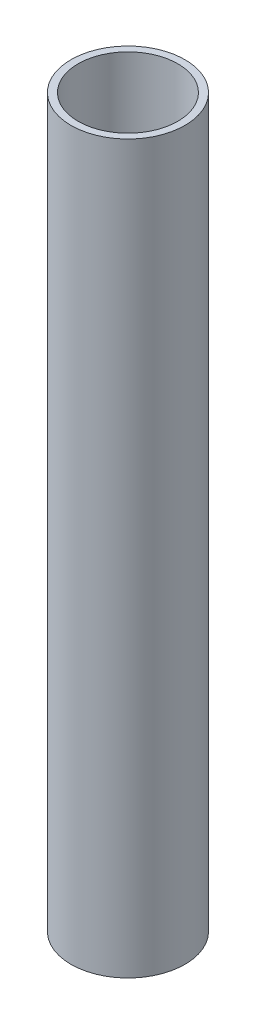
ISO-10303-21;
HEADER;
FILE_DESCRIPTION(('STEP AP214'),'2;1');
FILE_NAME('part.step','',(''),(''),'','','');
FILE_SCHEMA(('AUTOMOTIVE_DESIGN { 1 0 10303 214 1 1 1 1 }'));
ENDSEC;
DATA;
#1=APPLICATION_CONTEXT('core data for automotive mechanical design processes');
#2=APPLICATION_PROTOCOL_DEFINITION('international standard','automotive_design',2000,#1);
#3=PRODUCT_CONTEXT('',#1,'mechanical');
#4=PRODUCT('Part','Part','',(#3));
#5=PRODUCT_RELATED_PRODUCT_CATEGORY('part','',(#4));
#6=PRODUCT_DEFINITION_FORMATION('','',#4);
#7=PRODUCT_DEFINITION_CONTEXT('part definition',#1,'design');
#8=PRODUCT_DEFINITION('design','',#6,#7);
#9=PRODUCT_DEFINITION_SHAPE('','',#8);
#10=(LENGTH_UNIT() NAMED_UNIT(*) SI_UNIT(.MILLI.,.METRE.));
#11=(NAMED_UNIT(*) PLANE_ANGLE_UNIT() SI_UNIT($,.RADIAN.));
#12=(NAMED_UNIT(*) SI_UNIT($,.STERADIAN.) SOLID_ANGLE_UNIT());
#13=UNCERTAINTY_MEASURE_WITH_UNIT(LENGTH_MEASURE(1.E-05),#10,'distance_accuracy_value','');
#14=(GEOMETRIC_REPRESENTATION_CONTEXT(3) GLOBAL_UNCERTAINTY_ASSIGNED_CONTEXT((#13)) GLOBAL_UNIT_ASSIGNED_CONTEXT((#10,
#11,#12)) REPRESENTATION_CONTEXT('',''));
#15=CARTESIAN_POINT('',(0.,0.,0.));
#16=DIRECTION('',(0.,0.,1.));
#17=DIRECTION('',(1.,0.,0.));
#18=AXIS2_PLACEMENT_3D('',#15,#16,#17);
#19=CARTESIAN_POINT('',(0.,323.85,0.));
#20=DIRECTION('',(0.,1.,0.));
#21=DIRECTION('',(0.,0.,1.));
#22=AXIS2_PLACEMENT_3D('',#19,#20,#21);
#23=PLANE('',#22);
#24=CARTESIAN_POINT('',(0.,323.85,0.));
#25=DIRECTION('',(0.,1.,0.));
#26=DIRECTION('',(0.,0.,1.));
#27=AXIS2_PLACEMENT_3D('',#24,#25,#26);
#28=CIRCLE('',#27,25.4);
#29=CARTESIAN_POINT('',(0.,323.85,25.4));
#30=VERTEX_POINT('',#29);
#31=EDGE_CURVE('E10',#30,#30,#28,.T.);
#32=ORIENTED_EDGE('',*,*,#31,.T.);
#33=EDGE_LOOP('',(#32));
#34=FACE_BOUND('',#33,.T.);
#35=CARTESIAN_POINT('',(0.,323.85,0.));
#36=DIRECTION('',(0.,1.,0.));
#37=DIRECTION('',(0.,0.,1.));
#38=AXIS2_PLACEMENT_3D('',#35,#36,#37);
#39=CIRCLE('',#38,22.225);
#40=CARTESIAN_POINT('',(0.,323.85,22.225));
#41=VERTEX_POINT('',#40);
#42=EDGE_CURVE('E44',#41,#41,#39,.T.);
#43=ORIENTED_EDGE('',*,*,#42,.F.);
#44=EDGE_LOOP('',(#43));
#45=FACE_BOUND('',#44,.T.);
#46=ADVANCED_FACE('F30',(#34,#45),#23,.T.);
#47=CARTESIAN_POINT('',(0.,0.,0.));
#48=DIRECTION('',(0.,1.,0.));
#49=DIRECTION('',(0.,0.,1.));
#50=AXIS2_PLACEMENT_3D('',#47,#48,#49);
#51=PLANE('',#50);
#52=CARTESIAN_POINT('',(0.,0.,0.));
#53=DIRECTION('',(0.,1.,0.));
#54=DIRECTION('',(0.,0.,1.));
#55=AXIS2_PLACEMENT_3D('',#52,#53,#54);
#56=CIRCLE('',#55,25.4);
#57=CARTESIAN_POINT('',(0.,0.,25.4));
#58=VERTEX_POINT('',#57);
#59=EDGE_CURVE('E34',#58,#58,#56,.T.);
#60=ORIENTED_EDGE('',*,*,#59,.F.);
#61=EDGE_LOOP('',(#60));
#62=FACE_BOUND('',#61,.T.);
#63=CARTESIAN_POINT('',(0.,0.,0.));
#64=DIRECTION('',(0.,1.,0.));
#65=DIRECTION('',(0.,0.,1.));
#66=AXIS2_PLACEMENT_3D('',#63,#64,#65);
#67=CIRCLE('',#66,22.225);
#68=CARTESIAN_POINT('',(0.,0.,22.225));
#69=VERTEX_POINT('',#68);
#70=EDGE_CURVE('E46',#69,#69,#67,.T.);
#71=ORIENTED_EDGE('',*,*,#70,.T.);
#72=EDGE_LOOP('',(#71));
#73=FACE_BOUND('',#72,.T.);
#74=ADVANCED_FACE('F59',(#62,#73),#51,.F.);
#75=CARTESIAN_POINT('',(0.,323.85,0.));
#76=DIRECTION('',(0.,-1.,0.));
#77=DIRECTION('',(0.,0.,-1.));
#78=AXIS2_PLACEMENT_3D('',#75,#76,#77);
#79=CYLINDRICAL_SURFACE('',#78,25.4);
#80=ORIENTED_EDGE('',*,*,#31,.F.);
#81=EDGE_LOOP('',(#80));
#82=FACE_BOUND('',#81,.T.);
#83=ORIENTED_EDGE('',*,*,#59,.T.);
#84=EDGE_LOOP('',(#83));
#85=FACE_BOUND('',#84,.T.);
#86=ADVANCED_FACE('F32',(#82,#85),#79,.T.);
#87=CARTESIAN_POINT('',(0.,323.85,0.));
#88=DIRECTION('',(0.,-1.,0.));
#89=DIRECTION('',(0.,0.,-1.));
#90=AXIS2_PLACEMENT_3D('',#87,#88,#89);
#91=CYLINDRICAL_SURFACE('',#90,22.225);
#92=ORIENTED_EDGE('',*,*,#42,.T.);
#93=EDGE_LOOP('',(#92));
#94=FACE_BOUND('',#93,.T.);
#95=ORIENTED_EDGE('',*,*,#70,.F.);
#96=EDGE_LOOP('',(#95));
#97=FACE_BOUND('',#96,.T.);
#98=ADVANCED_FACE('F55',(#94,#97),#91,.F.);
#99=CLOSED_SHELL('',(#46,#74,#86,#98));
#100=MANIFOLD_SOLID_BREP('B2',#99);
#101=ADVANCED_BREP_SHAPE_REPRESENTATION('',(#18,#100),#14);
#102=SHAPE_DEFINITION_REPRESENTATION(#9,#101);
ENDSEC;
END-ISO-10303-21;
